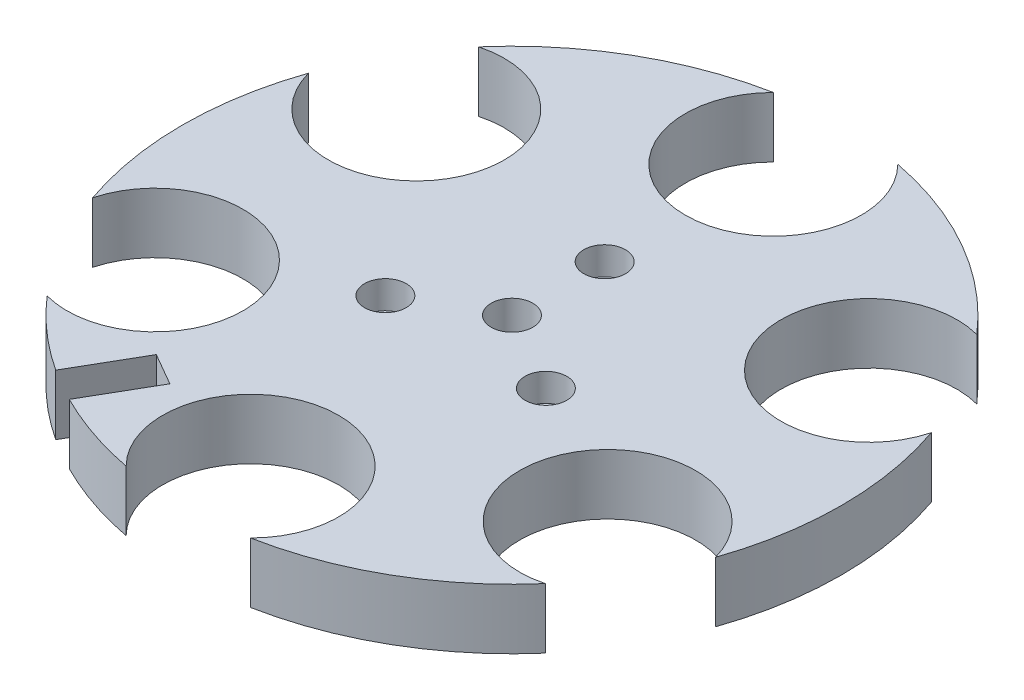
ISO-10303-21;
HEADER;
FILE_DESCRIPTION(('STEP AP214'),'2;1');
FILE_NAME('part.step','',(''),(''),'','','');
FILE_SCHEMA(('AUTOMOTIVE_DESIGN { 1 0 10303 214 1 1 1 1 }'));
ENDSEC;
DATA;
#1=APPLICATION_CONTEXT('core data for automotive mechanical design processes');
#2=APPLICATION_PROTOCOL_DEFINITION('international standard','automotive_design',2000,#1);
#3=PRODUCT_CONTEXT('',#1,'mechanical');
#4=PRODUCT('Part','Part','',(#3));
#5=PRODUCT_RELATED_PRODUCT_CATEGORY('part','',(#4));
#6=PRODUCT_DEFINITION_FORMATION('','',#4);
#7=PRODUCT_DEFINITION_CONTEXT('part definition',#1,'design');
#8=PRODUCT_DEFINITION('design','',#6,#7);
#9=PRODUCT_DEFINITION_SHAPE('','',#8);
#10=(LENGTH_UNIT() NAMED_UNIT(*) SI_UNIT(.MILLI.,.METRE.));
#11=(NAMED_UNIT(*) PLANE_ANGLE_UNIT() SI_UNIT($,.RADIAN.));
#12=(NAMED_UNIT(*) SI_UNIT($,.STERADIAN.) SOLID_ANGLE_UNIT());
#13=UNCERTAINTY_MEASURE_WITH_UNIT(LENGTH_MEASURE(1.E-05),#10,'distance_accuracy_value','');
#14=(GEOMETRIC_REPRESENTATION_CONTEXT(3) GLOBAL_UNCERTAINTY_ASSIGNED_CONTEXT((#13)) GLOBAL_UNIT_ASSIGNED_CONTEXT((#10,
#11,#12)) REPRESENTATION_CONTEXT('',''));
#15=CARTESIAN_POINT('',(0.,0.,0.));
#16=DIRECTION('',(0.,0.,1.));
#17=DIRECTION('',(1.,0.,0.));
#18=AXIS2_PLACEMENT_3D('',#15,#16,#17);
#19=CARTESIAN_POINT('',(0.,3.25,0.));
#20=DIRECTION('',(0.,-1.,0.));
#21=DIRECTION('',(0.,0.,-1.));
#22=AXIS2_PLACEMENT_3D('',#19,#20,#21);
#23=CYLINDRICAL_SURFACE('',#22,35.56);
#24=CARTESIAN_POINT('',(0.,-3.25,0.));
#25=DIRECTION('',(0.,1.,0.));
#26=DIRECTION('',(0.,0.,1.));
#27=AXIS2_PLACEMENT_3D('',#24,#25,#26);
#28=CIRCLE('',#27,35.56);
#29=CARTESIAN_POINT('',(-26.8844710838169,-3.25,23.275283339702));
#30=VERTEX_POINT('',#29);
#31=CARTESIAN_POINT('',(-19.4839070485369,-3.25,29.7471169380156));
#32=VERTEX_POINT('',#31);
#33=EDGE_CURVE('E316',#30,#32,#28,.T.);
#34=ORIENTED_EDGE('',*,*,#33,.T.);
#35=DIRECTION('',(0.,-1.,0.));
#36=VECTOR('',#35,1.);
#37=CARTESIAN_POINT('',(-19.4839070485368,3.25,29.7471169380156));
#38=LINE('',#37,#36);
#39=CARTESIAN_POINT('',(-19.4839070485369,3.25,29.7471169380156));
#40=VERTEX_POINT('',#39);
#41=EDGE_CURVE('E50',#32,#40,#38,.F.);
#42=ORIENTED_EDGE('',*,*,#41,.T.);
#43=CARTESIAN_POINT('',(0.,3.25,0.));
#44=DIRECTION('',(0.,1.,0.));
#45=DIRECTION('',(0.,0.,1.));
#46=AXIS2_PLACEMENT_3D('',#43,#44,#45);
#47=CIRCLE('',#46,35.56);
#48=CARTESIAN_POINT('',(-26.8844710838169,3.25,23.275283339702));
#49=VERTEX_POINT('',#48);
#50=EDGE_CURVE('E167',#49,#40,#47,.T.);
#51=ORIENTED_EDGE('',*,*,#50,.F.);
#52=DIRECTION('',(0.,1.,0.));
#53=VECTOR('',#52,1.);
#54=CARTESIAN_POINT('',(-26.8844710838169,0.,23.275283339702));
#55=LINE('',#54,#53);
#56=EDGE_CURVE('E231',#49,#30,#55,.F.);
#57=ORIENTED_EDGE('',*,*,#56,.T.);
#58=EDGE_LOOP('',(#34,#42,#51,#57));
#59=FACE_BOUND('',#58,.T.);
#60=ADVANCED_FACE('F35',(#59),#23,.T.);
#61=CARTESIAN_POINT('',(33.5992221943712,-3.25,11.6449932560425));
#62=VERTEX_POINT('',#61);
#63=CARTESIAN_POINT('',(33.5992221943709,-3.25,-11.6449932560432));
#64=VERTEX_POINT('',#63);
#65=EDGE_CURVE('E320',#62,#64,#28,.T.);
#66=ORIENTED_EDGE('',*,*,#65,.T.);
#67=DIRECTION('',(0.,1.,0.));
#68=VECTOR('',#67,1.);
#69=CARTESIAN_POINT('',(33.5992221943709,0.,-11.6449932560432));
#70=LINE('',#69,#68);
#71=CARTESIAN_POINT('',(33.5992221943709,3.25,-11.6449932560432));
#72=VERTEX_POINT('',#71);
#73=EDGE_CURVE('E57',#64,#72,#70,.T.);
#74=ORIENTED_EDGE('',*,*,#73,.T.);
#75=CARTESIAN_POINT('',(33.5992221943712,3.25,11.6449932560425));
#76=VERTEX_POINT('',#75);
#77=EDGE_CURVE('E334',#76,#72,#47,.T.);
#78=ORIENTED_EDGE('',*,*,#77,.F.);
#79=DIRECTION('',(0.,1.,0.));
#80=VECTOR('',#79,1.);
#81=CARTESIAN_POINT('',(33.5992221943712,0.,11.6449932560425));
#82=LINE('',#81,#80);
#83=EDGE_CURVE('E243',#76,#62,#82,.F.);
#84=ORIENTED_EDGE('',*,*,#83,.T.);
#85=EDGE_LOOP('',(#66,#74,#78,#84));
#86=FACE_BOUND('',#85,.T.);
#87=ADVANCED_FACE('F327',(#86),#23,.T.);
#88=CARTESIAN_POINT('',(6.714751110554,-3.25,34.9202765957447));
#89=VERTEX_POINT('',#88);
#90=CARTESIAN_POINT('',(26.8844710838173,-3.25,23.2752833397016));
#91=VERTEX_POINT('',#90);
#92=EDGE_CURVE('E317',#89,#91,#28,.T.);
#93=ORIENTED_EDGE('',*,*,#92,.T.);
#94=DIRECTION('',(0.,1.,0.));
#95=VECTOR('',#94,1.);
#96=CARTESIAN_POINT('',(26.8844710838173,0.,23.2752833397016));
#97=LINE('',#96,#95);
#98=CARTESIAN_POINT('',(26.8844710838173,3.25,23.2752833397016));
#99=VERTEX_POINT('',#98);
#100=EDGE_CURVE('E246',#91,#99,#97,.T.);
#101=ORIENTED_EDGE('',*,*,#100,.T.);
#102=CARTESIAN_POINT('',(6.714751110554,3.25,34.9202765957447));
#103=VERTEX_POINT('',#102);
#104=EDGE_CURVE('E335',#103,#99,#47,.T.);
#105=ORIENTED_EDGE('',*,*,#104,.F.);
#106=DIRECTION('',(0.,1.,0.));
#107=VECTOR('',#106,1.);
#108=CARTESIAN_POINT('',(6.714751110554,0.,34.9202765957447));
#109=LINE('',#108,#107);
#110=EDGE_CURVE('E237',#103,#89,#109,.F.);
#111=ORIENTED_EDGE('',*,*,#110,.T.);
#112=EDGE_LOOP('',(#93,#101,#105,#111));
#113=FACE_BOUND('',#112,.T.);
#114=ADVANCED_FACE('F342',(#113),#23,.T.);
#115=CARTESIAN_POINT('',(-16.0198054333988,3.25,31.7471169380158));
#116=VERTEX_POINT('',#115);
#117=CARTESIAN_POINT('',(-6.714751110554,3.25,34.9202765957447));
#118=VERTEX_POINT('',#117);
#119=EDGE_CURVE('E268',#116,#118,#47,.T.);
#120=ORIENTED_EDGE('',*,*,#119,.F.);
#121=DIRECTION('',(0.,-1.,0.));
#122=VECTOR('',#121,1.);
#123=CARTESIAN_POINT('',(-16.0198054333988,3.25,31.7471169380157));
#124=LINE('',#123,#122);
#125=CARTESIAN_POINT('',(-16.0198054333988,-3.25,31.7471169380158));
#126=VERTEX_POINT('',#125);
#127=EDGE_CURVE('E178',#116,#126,#124,.T.);
#128=ORIENTED_EDGE('',*,*,#127,.T.);
#129=CARTESIAN_POINT('',(-6.714751110554,-3.25,34.9202765957447));
#130=VERTEX_POINT('',#129);
#131=EDGE_CURVE('E274',#126,#130,#28,.T.);
#132=ORIENTED_EDGE('',*,*,#131,.T.);
#133=DIRECTION('',(0.,1.,0.));
#134=VECTOR('',#133,1.);
#135=CARTESIAN_POINT('',(-6.714751110554,0.,34.9202765957447));
#136=LINE('',#135,#134);
#137=EDGE_CURVE('E240',#130,#118,#136,.T.);
#138=ORIENTED_EDGE('',*,*,#137,.T.);
#139=EDGE_LOOP('',(#120,#128,#132,#138));
#140=FACE_BOUND('',#139,.T.);
#141=ADVANCED_FACE('F374',(#140),#23,.T.);
#142=CARTESIAN_POINT('',(-33.5992221943711,-3.25,-11.6449932560427));
#143=VERTEX_POINT('',#142);
#144=CARTESIAN_POINT('',(-33.599222194371,-3.25,11.6449932560429));
#145=VERTEX_POINT('',#144);
#146=EDGE_CURVE('E273',#143,#145,#28,.T.);
#147=ORIENTED_EDGE('',*,*,#146,.T.);
#148=DIRECTION('',(0.,1.,0.));
#149=VECTOR('',#148,1.);
#150=CARTESIAN_POINT('',(-33.599222194371,0.,11.6449932560429));
#151=LINE('',#150,#149);
#152=CARTESIAN_POINT('',(-33.599222194371,3.25,11.6449932560429));
#153=VERTEX_POINT('',#152);
#154=EDGE_CURVE('E234',#145,#153,#151,.T.);
#155=ORIENTED_EDGE('',*,*,#154,.T.);
#156=CARTESIAN_POINT('',(-33.5992221943711,3.25,-11.6449932560427));
#157=VERTEX_POINT('',#156);
#158=EDGE_CURVE('E267',#157,#153,#47,.T.);
#159=ORIENTED_EDGE('',*,*,#158,.F.);
#160=DIRECTION('',(0.,1.,0.));
#161=VECTOR('',#160,1.);
#162=CARTESIAN_POINT('',(-33.5992221943711,0.,-11.6449932560427));
#163=LINE('',#162,#161);
#164=EDGE_CURVE('E225',#157,#143,#163,.F.);
#165=ORIENTED_EDGE('',*,*,#164,.T.);
#166=EDGE_LOOP('',(#147,#155,#159,#165));
#167=FACE_BOUND('',#166,.T.);
#168=ADVANCED_FACE('F369',(#167),#23,.T.);
#169=CARTESIAN_POINT('',(-6.714751110554,-3.25,-34.9202765957447));
#170=VERTEX_POINT('',#169);
#171=CARTESIAN_POINT('',(-26.8844710838171,-3.25,-23.2752833397018));
#172=VERTEX_POINT('',#171);
#173=EDGE_CURVE('E269',#170,#172,#28,.T.);
#174=ORIENTED_EDGE('',*,*,#173,.T.);
#175=DIRECTION('',(0.,1.,0.));
#176=VECTOR('',#175,1.);
#177=CARTESIAN_POINT('',(-26.8844710838171,0.,-23.2752833397018));
#178=LINE('',#177,#176);
#179=CARTESIAN_POINT('',(-26.8844710838171,3.25,-23.2752833397018));
#180=VERTEX_POINT('',#179);
#181=EDGE_CURVE('E228',#172,#180,#178,.T.);
#182=ORIENTED_EDGE('',*,*,#181,.T.);
#183=CARTESIAN_POINT('',(-6.714751110554,3.25,-34.9202765957447));
#184=VERTEX_POINT('',#183);
#185=EDGE_CURVE('E263',#184,#180,#47,.T.);
#186=ORIENTED_EDGE('',*,*,#185,.F.);
#187=DIRECTION('',(0.,1.,0.));
#188=VECTOR('',#187,1.);
#189=CARTESIAN_POINT('',(-6.714751110554,0.,-34.9202765957447));
#190=LINE('',#189,#188);
#191=EDGE_CURVE('E256',#184,#170,#190,.F.);
#192=ORIENTED_EDGE('',*,*,#191,.T.);
#193=EDGE_LOOP('',(#174,#182,#186,#192));
#194=FACE_BOUND('',#193,.T.);
#195=ADVANCED_FACE('F363',(#194),#23,.T.);
#196=CARTESIAN_POINT('',(26.8844710838168,3.25,-23.2752833397022));
#197=VERTEX_POINT('',#196);
#198=CARTESIAN_POINT('',(6.714751110554,3.25,-34.9202765957447));
#199=VERTEX_POINT('',#198);
#200=EDGE_CURVE('E272',#197,#199,#47,.T.);
#201=ORIENTED_EDGE('',*,*,#200,.F.);
#202=DIRECTION('',(0.,1.,0.));
#203=VECTOR('',#202,1.);
#204=CARTESIAN_POINT('',(26.8844710838168,0.,-23.2752833397022));
#205=LINE('',#204,#203);
#206=CARTESIAN_POINT('',(26.8844710838168,-3.25,-23.2752833397022));
#207=VERTEX_POINT('',#206);
#208=EDGE_CURVE('E249',#197,#207,#205,.F.);
#209=ORIENTED_EDGE('',*,*,#208,.T.);
#210=CARTESIAN_POINT('',(6.714751110554,-3.25,-34.9202765957447));
#211=VERTEX_POINT('',#210);
#212=EDGE_CURVE('E262',#207,#211,#28,.T.);
#213=ORIENTED_EDGE('',*,*,#212,.T.);
#214=DIRECTION('',(0.,1.,0.));
#215=VECTOR('',#214,1.);
#216=CARTESIAN_POINT('',(6.714751110554,0.,-34.9202765957447));
#217=LINE('',#216,#215);
#218=EDGE_CURVE('E259',#211,#199,#217,.T.);
#219=ORIENTED_EDGE('',*,*,#218,.T.);
#220=EDGE_LOOP('',(#201,#209,#213,#219));
#221=FACE_BOUND('',#220,.T.);
#222=ADVANCED_FACE('F37',(#221),#23,.T.);
#223=CARTESIAN_POINT('',(0.,3.25,0.));
#224=DIRECTION('',(0.,1.,0.));
#225=DIRECTION('',(0.,0.,1.));
#226=AXIS2_PLACEMENT_3D('',#223,#224,#225);
#227=PLANE('',#226);
#228=DIRECTION('',(-0.499999999999958,0.,0.866025403784463));
#229=VECTOR('',#228,1.);
#230=CARTESIAN_POINT('',(-12.0479491924309,3.25,24.8676601282992));
#231=LINE('',#230,#229);
#232=CARTESIAN_POINT('',(-12.0479491924309,3.25,24.8676601282992));
#233=VERTEX_POINT('',#232);
#234=EDGE_CURVE('E168',#233,#116,#231,.T.);
#235=ORIENTED_EDGE('',*,*,#234,.T.);
#236=ORIENTED_EDGE('',*,*,#119,.T.);
#237=CARTESIAN_POINT('',(0.,3.25,28.2));
#238=DIRECTION('',(0.,1.,0.));
#239=DIRECTION('',(0.,0.,-1.));
#240=AXIS2_PLACEMENT_3D('',#237,#238,#239);
#241=CIRCLE('',#240,9.5);
#242=EDGE_CURVE('E218',#103,#118,#241,.T.);
#243=ORIENTED_EDGE('',*,*,#242,.F.);
#244=ORIENTED_EDGE('',*,*,#104,.T.);
#245=CARTESIAN_POINT('',(24.4219163867213,3.25,14.0999999999998));
#246=DIRECTION('',(0.,1.,0.));
#247=DIRECTION('',(-0.866025403784443,0.,-0.499999999999992));
#248=AXIS2_PLACEMENT_3D('',#245,#246,#247);
#249=CIRCLE('',#248,9.5);
#250=EDGE_CURVE('E221',#76,#99,#249,.T.);
#251=ORIENTED_EDGE('',*,*,#250,.F.);
#252=ORIENTED_EDGE('',*,*,#77,.T.);
#253=CARTESIAN_POINT('',(24.421916386721,3.25,-14.1000000000003));
#254=DIRECTION('',(0.,1.,0.));
#255=DIRECTION('',(-0.866025403784433,0.,0.50000000000001));
#256=AXIS2_PLACEMENT_3D('',#253,#254,#255);
#257=CIRCLE('',#256,9.5);
#258=EDGE_CURVE('E212',#197,#72,#257,.T.);
#259=ORIENTED_EDGE('',*,*,#258,.F.);
#260=ORIENTED_EDGE('',*,*,#200,.T.);
#261=CARTESIAN_POINT('',(0.,3.25,-28.2));
#262=DIRECTION('',(0.,1.,0.));
#263=DIRECTION('',(0.,0.,1.));
#264=AXIS2_PLACEMENT_3D('',#261,#262,#263);
#265=CIRCLE('',#264,9.5);
#266=EDGE_CURVE('E253',#184,#199,#265,.T.);
#267=ORIENTED_EDGE('',*,*,#266,.F.);
#268=ORIENTED_EDGE('',*,*,#185,.T.);
#269=CARTESIAN_POINT('',(-24.4219163867212,3.25,-14.0999999999999));
#270=DIRECTION('',(0.,1.,0.));
#271=DIRECTION('',(0.86602540378444,0.,0.499999999999998));
#272=AXIS2_PLACEMENT_3D('',#269,#270,#271);
#273=CIRCLE('',#272,9.5);
#274=EDGE_CURVE('E217',#157,#180,#273,.T.);
#275=ORIENTED_EDGE('',*,*,#274,.F.);
#276=ORIENTED_EDGE('',*,*,#158,.T.);
#277=CARTESIAN_POINT('',(-24.4219163867211,3.25,14.1000000000001));
#278=DIRECTION('',(0.,1.,0.));
#279=DIRECTION('',(0.866025403784436,0.,-0.500000000000004));
#280=AXIS2_PLACEMENT_3D('',#277,#278,#279);
#281=CIRCLE('',#280,9.5);
#282=EDGE_CURVE('E215',#49,#153,#281,.T.);
#283=ORIENTED_EDGE('',*,*,#282,.F.);
#284=ORIENTED_EDGE('',*,*,#50,.T.);
#285=DIRECTION('',(0.499999999999995,0.,-0.866025403784442));
#286=VECTOR('',#285,1.);
#287=CARTESIAN_POINT('',(-15.5120508075687,3.25,22.8676601282992));
#288=LINE('',#287,#286);
#289=CARTESIAN_POINT('',(-15.5120508075687,3.25,22.8676601282992));
#290=VERTEX_POINT('',#289);
#291=EDGE_CURVE('E149',#40,#290,#288,.T.);
#292=ORIENTED_EDGE('',*,*,#291,.T.);
#293=DIRECTION('',(0.866025403784447,0.,0.499999999999985));
#294=VECTOR('',#293,1.);
#295=CARTESIAN_POINT('',(-12.0479491924309,3.25,24.8676601282992));
#296=LINE('',#295,#294);
#297=EDGE_CURVE('E154',#290,#233,#296,.T.);
#298=ORIENTED_EDGE('',*,*,#297,.T.);
#299=EDGE_LOOP('',(#235,#236,#243,#244,#251,#252,#259,#260,#267,#268,#275,#276,#283,#284,#292,#298));
#300=FACE_BOUND('',#299,.T.);
#301=CARTESIAN_POINT('',(0.,3.25,0.));
#302=DIRECTION('',(0.,1.,0.));
#303=DIRECTION('',(0.,0.,1.));
#304=AXIS2_PLACEMENT_3D('',#301,#302,#303);
#305=CIRCLE('',#304,2.25);
#306=CARTESIAN_POINT('',(0.,3.25,2.25));
#307=VERTEX_POINT('',#306);
#308=EDGE_CURVE('E193',#307,#307,#305,.T.);
#309=ORIENTED_EDGE('',*,*,#308,.F.);
#310=EDGE_LOOP('',(#309));
#311=FACE_BOUND('',#310,.T.);
#312=CARTESIAN_POINT('',(-8.66025403784437,3.25,5.00000000000004));
#313=DIRECTION('',(0.,1.,0.));
#314=DIRECTION('',(0.866025403784436,0.,-0.500000000000004));
#315=AXIS2_PLACEMENT_3D('',#312,#313,#314);
#316=CIRCLE('',#315,2.25);
#317=CARTESIAN_POINT('',(-6.71169687932938,3.25,3.87500000000003));
#318=VERTEX_POINT('',#317);
#319=EDGE_CURVE('E201',#318,#318,#316,.T.);
#320=ORIENTED_EDGE('',*,*,#319,.F.);
#321=EDGE_LOOP('',(#320));
#322=FACE_BOUND('',#321,.T.);
#323=CARTESIAN_POINT('',(8.66025403784443,3.25,4.99999999999992));
#324=DIRECTION('',(0.,1.,0.));
#325=DIRECTION('',(-0.866025403784443,0.,-0.499999999999992));
#326=AXIS2_PLACEMENT_3D('',#323,#324,#325);
#327=CIRCLE('',#326,2.25);
#328=CARTESIAN_POINT('',(6.71169687932943,3.25,3.87499999999994));
#329=VERTEX_POINT('',#328);
#330=EDGE_CURVE('E196',#329,#329,#327,.T.);
#331=ORIENTED_EDGE('',*,*,#330,.F.);
#332=EDGE_LOOP('',(#331));
#333=FACE_BOUND('',#332,.T.);
#334=CARTESIAN_POINT('',(0.,3.25,-10.));
#335=DIRECTION('',(0.,1.,0.));
#336=DIRECTION('',(0.,0.,1.));
#337=AXIS2_PLACEMENT_3D('',#334,#335,#336);
#338=CIRCLE('',#337,2.25);
#339=CARTESIAN_POINT('',(0.,3.25,-7.75));
#340=VERTEX_POINT('',#339);
#341=EDGE_CURVE('E200',#340,#340,#338,.T.);
#342=ORIENTED_EDGE('',*,*,#341,.F.);
#343=EDGE_LOOP('',(#342));
#344=FACE_BOUND('',#343,.T.);
#345=ADVANCED_FACE('F163',(#300,#311,#322,#333,#344),#227,.T.);
#346=CARTESIAN_POINT('',(0.,-3.25,0.));
#347=DIRECTION('',(0.,1.,0.));
#348=DIRECTION('',(0.,0.,1.));
#349=AXIS2_PLACEMENT_3D('',#346,#347,#348);
#350=PLANE('',#349);
#351=CARTESIAN_POINT('',(8.66025403784443,-3.25,4.99999999999992));
#352=DIRECTION('',(0.,1.,0.));
#353=DIRECTION('',(0.,0.,1.));
#354=AXIS2_PLACEMENT_3D('',#351,#352,#353);
#355=CIRCLE('',#354,2.);
#356=CARTESIAN_POINT('',(8.66025403784443,-3.25,6.99999999999992));
#357=VERTEX_POINT('',#356);
#358=EDGE_CURVE('E43',#357,#357,#355,.F.);
#359=ORIENTED_EDGE('',*,*,#358,.F.);
#360=EDGE_LOOP('',(#359));
#361=FACE_BOUND('',#360,.T.);
#362=CARTESIAN_POINT('',(-8.66025403784437,-3.25,5.00000000000004));
#363=DIRECTION('',(0.,1.,0.));
#364=DIRECTION('',(0.,0.,1.));
#365=AXIS2_PLACEMENT_3D('',#362,#363,#364);
#366=CIRCLE('',#365,2.);
#367=CARTESIAN_POINT('',(-8.66025403784437,-3.25,7.00000000000004));
#368=VERTEX_POINT('',#367);
#369=EDGE_CURVE('E294',#368,#368,#366,.F.);
#370=ORIENTED_EDGE('',*,*,#369,.F.);
#371=EDGE_LOOP('',(#370));
#372=FACE_BOUND('',#371,.T.);
#373=CARTESIAN_POINT('',(0.,-3.25,-10.));
#374=DIRECTION('',(0.,1.,0.));
#375=DIRECTION('',(0.,0.,1.));
#376=AXIS2_PLACEMENT_3D('',#373,#374,#375);
#377=CIRCLE('',#376,2.);
#378=CARTESIAN_POINT('',(0.,-3.25,-8.));
#379=VERTEX_POINT('',#378);
#380=EDGE_CURVE('E291',#379,#379,#377,.F.);
#381=ORIENTED_EDGE('',*,*,#380,.F.);
#382=EDGE_LOOP('',(#381));
#383=FACE_BOUND('',#382,.T.);
#384=CARTESIAN_POINT('',(0.,-3.25,0.));
#385=DIRECTION('',(0.,1.,0.));
#386=DIRECTION('',(0.,0.,1.));
#387=AXIS2_PLACEMENT_3D('',#384,#385,#386);
#388=CIRCLE('',#387,2.25);
#389=CARTESIAN_POINT('',(0.,-3.25,2.25));
#390=VERTEX_POINT('',#389);
#391=EDGE_CURVE('E190',#390,#390,#388,.T.);
#392=ORIENTED_EDGE('',*,*,#391,.T.);
#393=EDGE_LOOP('',(#392));
#394=FACE_BOUND('',#393,.T.);
#395=ORIENTED_EDGE('',*,*,#131,.F.);
#396=DIRECTION('',(-0.499999999999958,0.,0.866025403784463));
#397=VECTOR('',#396,1.);
#398=CARTESIAN_POINT('',(-12.0479491924309,-3.25,24.8676601282992));
#399=LINE('',#398,#397);
#400=CARTESIAN_POINT('',(-12.0479491924309,-3.25,24.8676601282992));
#401=VERTEX_POINT('',#400);
#402=EDGE_CURVE('E173',#401,#126,#399,.T.);
#403=ORIENTED_EDGE('',*,*,#402,.F.);
#404=DIRECTION('',(0.866025403784447,0.,0.499999999999985));
#405=VECTOR('',#404,1.);
#406=CARTESIAN_POINT('',(-12.0479491924309,-3.25,24.8676601282992));
#407=LINE('',#406,#405);
#408=CARTESIAN_POINT('',(-15.5120508075687,-3.25,22.8676601282992));
#409=VERTEX_POINT('',#408);
#410=EDGE_CURVE('E170',#409,#401,#407,.T.);
#411=ORIENTED_EDGE('',*,*,#410,.F.);
#412=DIRECTION('',(-0.499999999999995,0.,0.866025403784442));
#413=VECTOR('',#412,1.);
#414=CARTESIAN_POINT('',(-1.73205080756889,-3.25,-0.999999999999992));
#415=LINE('',#414,#413);
#416=EDGE_CURVE('E11',#409,#32,#415,.T.);
#417=ORIENTED_EDGE('',*,*,#416,.T.);
#418=ORIENTED_EDGE('',*,*,#33,.F.);
#419=CARTESIAN_POINT('',(-24.4219163867211,-3.25,14.1000000000001));
#420=DIRECTION('',(0.,1.,0.));
#421=DIRECTION('',(0.,0.,1.));
#422=AXIS2_PLACEMENT_3D('',#419,#420,#421);
#423=CIRCLE('',#422,9.5);
#424=EDGE_CURVE('E280',#30,#145,#423,.T.);
#425=ORIENTED_EDGE('',*,*,#424,.T.);
#426=ORIENTED_EDGE('',*,*,#146,.F.);
#427=CARTESIAN_POINT('',(-24.4219163867212,-3.25,-14.0999999999999));
#428=DIRECTION('',(0.,1.,0.));
#429=DIRECTION('',(0.,0.,1.));
#430=AXIS2_PLACEMENT_3D('',#427,#428,#429);
#431=CIRCLE('',#430,9.5);
#432=EDGE_CURVE('E277',#143,#172,#431,.T.);
#433=ORIENTED_EDGE('',*,*,#432,.T.);
#434=ORIENTED_EDGE('',*,*,#173,.F.);
#435=CARTESIAN_POINT('',(0.,-3.25,-28.2));
#436=DIRECTION('',(0.,1.,0.));
#437=DIRECTION('',(0.,0.,1.));
#438=AXIS2_PLACEMENT_3D('',#435,#436,#437);
#439=CIRCLE('',#438,9.5);
#440=EDGE_CURVE('E266',#170,#211,#439,.T.);
#441=ORIENTED_EDGE('',*,*,#440,.T.);
#442=ORIENTED_EDGE('',*,*,#212,.F.);
#443=CARTESIAN_POINT('',(24.421916386721,-3.25,-14.1000000000003));
#444=DIRECTION('',(0.,1.,0.));
#445=DIRECTION('',(0.,0.,1.));
#446=AXIS2_PLACEMENT_3D('',#443,#444,#445);
#447=CIRCLE('',#446,9.5);
#448=EDGE_CURVE('E289',#207,#64,#447,.T.);
#449=ORIENTED_EDGE('',*,*,#448,.T.);
#450=ORIENTED_EDGE('',*,*,#65,.F.);
#451=CARTESIAN_POINT('',(24.4219163867213,-3.25,14.0999999999998));
#452=DIRECTION('',(0.,1.,0.));
#453=DIRECTION('',(0.,0.,1.));
#454=AXIS2_PLACEMENT_3D('',#451,#452,#453);
#455=CIRCLE('',#454,9.5);
#456=EDGE_CURVE('E286',#62,#91,#455,.T.);
#457=ORIENTED_EDGE('',*,*,#456,.T.);
#458=ORIENTED_EDGE('',*,*,#92,.F.);
#459=CARTESIAN_POINT('',(0.,-3.25,28.2));
#460=DIRECTION('',(0.,1.,0.));
#461=DIRECTION('',(0.,0.,1.));
#462=AXIS2_PLACEMENT_3D('',#459,#460,#461);
#463=CIRCLE('',#462,9.5);
#464=EDGE_CURVE('E283',#89,#130,#463,.T.);
#465=ORIENTED_EDGE('',*,*,#464,.T.);
#466=EDGE_LOOP('',(#395,#403,#411,#417,#418,#425,#426,#433,#434,#441,#442,#449,#450,#457,#458,#465));
#467=FACE_BOUND('',#466,.T.);
#468=ADVANCED_FACE('F301',(#361,#372,#383,#394,#467),#350,.F.);
#469=CARTESIAN_POINT('',(0.,-3.25,-28.2));
#470=DIRECTION('',(0.,1.,0.));
#471=DIRECTION('',(0.,0.,1.));
#472=AXIS2_PLACEMENT_3D('',#469,#470,#471);
#473=CYLINDRICAL_SURFACE('',#472,9.5);
#474=ORIENTED_EDGE('',*,*,#440,.F.);
#475=ORIENTED_EDGE('',*,*,#191,.F.);
#476=ORIENTED_EDGE('',*,*,#266,.T.);
#477=ORIENTED_EDGE('',*,*,#218,.F.);
#478=EDGE_LOOP('',(#474,#475,#476,#477));
#479=FACE_BOUND('',#478,.T.);
#480=ADVANCED_FACE('F304',(#479),#473,.F.);
#481=CARTESIAN_POINT('',(-24.4219163867212,-3.25,-14.0999999999999));
#482=DIRECTION('',(0.,1.,0.));
#483=DIRECTION('',(0.,0.,1.));
#484=AXIS2_PLACEMENT_3D('',#481,#482,#483);
#485=CYLINDRICAL_SURFACE('',#484,9.5);
#486=ORIENTED_EDGE('',*,*,#432,.F.);
#487=ORIENTED_EDGE('',*,*,#164,.F.);
#488=ORIENTED_EDGE('',*,*,#274,.T.);
#489=ORIENTED_EDGE('',*,*,#181,.F.);
#490=EDGE_LOOP('',(#486,#487,#488,#489));
#491=FACE_BOUND('',#490,.T.);
#492=ADVANCED_FACE('F381',(#491),#485,.F.);
#493=CARTESIAN_POINT('',(-24.4219163867211,-3.25,14.1000000000001));
#494=DIRECTION('',(0.,1.,0.));
#495=DIRECTION('',(0.,0.,1.));
#496=AXIS2_PLACEMENT_3D('',#493,#494,#495);
#497=CYLINDRICAL_SURFACE('',#496,9.5);
#498=ORIENTED_EDGE('',*,*,#424,.F.);
#499=ORIENTED_EDGE('',*,*,#56,.F.);
#500=ORIENTED_EDGE('',*,*,#282,.T.);
#501=ORIENTED_EDGE('',*,*,#154,.F.);
#502=EDGE_LOOP('',(#498,#499,#500,#501));
#503=FACE_BOUND('',#502,.T.);
#504=ADVANCED_FACE('F354',(#503),#497,.F.);
#505=CARTESIAN_POINT('',(0.,-3.25,28.2));
#506=DIRECTION('',(0.,1.,0.));
#507=DIRECTION('',(0.,0.,1.));
#508=AXIS2_PLACEMENT_3D('',#505,#506,#507);
#509=CYLINDRICAL_SURFACE('',#508,9.5);
#510=ORIENTED_EDGE('',*,*,#464,.F.);
#511=ORIENTED_EDGE('',*,*,#110,.F.);
#512=ORIENTED_EDGE('',*,*,#242,.T.);
#513=ORIENTED_EDGE('',*,*,#137,.F.);
#514=EDGE_LOOP('',(#510,#511,#512,#513));
#515=FACE_BOUND('',#514,.T.);
#516=ADVANCED_FACE('F346',(#515),#509,.F.);
#517=CARTESIAN_POINT('',(24.4219163867213,-3.25,14.0999999999998));
#518=DIRECTION('',(0.,1.,0.));
#519=DIRECTION('',(0.,0.,1.));
#520=AXIS2_PLACEMENT_3D('',#517,#518,#519);
#521=CYLINDRICAL_SURFACE('',#520,9.5);
#522=ORIENTED_EDGE('',*,*,#456,.F.);
#523=ORIENTED_EDGE('',*,*,#83,.F.);
#524=ORIENTED_EDGE('',*,*,#250,.T.);
#525=ORIENTED_EDGE('',*,*,#100,.F.);
#526=EDGE_LOOP('',(#522,#523,#524,#525));
#527=FACE_BOUND('',#526,.T.);
#528=ADVANCED_FACE('F344',(#527),#521,.F.);
#529=CARTESIAN_POINT('',(24.421916386721,-3.25,-14.1000000000003));
#530=DIRECTION('',(0.,1.,0.));
#531=DIRECTION('',(0.,0.,1.));
#532=AXIS2_PLACEMENT_3D('',#529,#530,#531);
#533=CYLINDRICAL_SURFACE('',#532,9.5);
#534=ORIENTED_EDGE('',*,*,#448,.F.);
#535=ORIENTED_EDGE('',*,*,#208,.F.);
#536=ORIENTED_EDGE('',*,*,#258,.T.);
#537=ORIENTED_EDGE('',*,*,#73,.F.);
#538=EDGE_LOOP('',(#534,#535,#536,#537));
#539=FACE_BOUND('',#538,.T.);
#540=ADVANCED_FACE('F330',(#539),#533,.F.);
#541=CARTESIAN_POINT('',(0.,0.25,-10.));
#542=DIRECTION('',(0.,1.,0.));
#543=DIRECTION('',(0.,0.,1.));
#544=AXIS2_PLACEMENT_3D('',#541,#542,#543);
#545=CYLINDRICAL_SURFACE('',#544,2.25);
#546=CARTESIAN_POINT('',(0.,0.25,-10.));
#547=DIRECTION('',(0.,1.,0.));
#548=DIRECTION('',(0.,0.,1.));
#549=AXIS2_PLACEMENT_3D('',#546,#547,#548);
#550=CIRCLE('',#549,2.25);
#551=CARTESIAN_POINT('',(0.,0.25,-7.75));
#552=VERTEX_POINT('',#551);
#553=EDGE_CURVE('E209',#552,#552,#550,.T.);
#554=ORIENTED_EDGE('',*,*,#553,.F.);
#555=EDGE_LOOP('',(#554));
#556=FACE_BOUND('',#555,.T.);
#557=ORIENTED_EDGE('',*,*,#341,.T.);
#558=EDGE_LOOP('',(#557));
#559=FACE_BOUND('',#558,.T.);
#560=ADVANCED_FACE('F352',(#556,#559),#545,.F.);
#561=CARTESIAN_POINT('',(0.,0.25,-10.));
#562=DIRECTION('',(0.,1.,0.));
#563=DIRECTION('',(0.,0.,1.));
#564=AXIS2_PLACEMENT_3D('',#561,#562,#563);
#565=PLANE('',#564);
#566=ORIENTED_EDGE('',*,*,#553,.T.);
#567=EDGE_LOOP('',(#566));
#568=FACE_BOUND('',#567,.T.);
#569=ADVANCED_FACE('F402',(#568),#565,.T.);
#570=CARTESIAN_POINT('',(8.66025403784443,0.25,4.99999999999992));
#571=DIRECTION('',(0.,1.,0.));
#572=DIRECTION('',(0.,0.,1.));
#573=AXIS2_PLACEMENT_3D('',#570,#571,#572);
#574=CYLINDRICAL_SURFACE('',#573,2.25);
#575=CARTESIAN_POINT('',(8.66025403784443,0.25,4.99999999999992));
#576=DIRECTION('',(0.,1.,0.));
#577=DIRECTION('',(-0.866025403784443,0.,-0.499999999999992));
#578=AXIS2_PLACEMENT_3D('',#575,#576,#577);
#579=CIRCLE('',#578,2.25);
#580=CARTESIAN_POINT('',(6.71169687932943,0.25,3.87499999999994));
#581=VERTEX_POINT('',#580);
#582=EDGE_CURVE('E204',#581,#581,#579,.T.);
#583=ORIENTED_EDGE('',*,*,#582,.F.);
#584=EDGE_LOOP('',(#583));
#585=FACE_BOUND('',#584,.T.);
#586=ORIENTED_EDGE('',*,*,#330,.T.);
#587=EDGE_LOOP('',(#586));
#588=FACE_BOUND('',#587,.T.);
#589=ADVANCED_FACE('F406',(#585,#588),#574,.F.);
#590=CARTESIAN_POINT('',(8.66025403784443,0.25,4.99999999999992));
#591=DIRECTION('',(0.,1.,0.));
#592=DIRECTION('',(-0.866025403784443,0.,-0.499999999999992));
#593=AXIS2_PLACEMENT_3D('',#590,#591,#592);
#594=PLANE('',#593);
#595=ORIENTED_EDGE('',*,*,#582,.T.);
#596=EDGE_LOOP('',(#595));
#597=FACE_BOUND('',#596,.T.);
#598=ADVANCED_FACE('F410',(#597),#594,.T.);
#599=CARTESIAN_POINT('',(-8.66025403784437,0.25,5.00000000000004));
#600=DIRECTION('',(0.,1.,0.));
#601=DIRECTION('',(0.,0.,1.));
#602=AXIS2_PLACEMENT_3D('',#599,#600,#601);
#603=CYLINDRICAL_SURFACE('',#602,2.25);
#604=CARTESIAN_POINT('',(-8.66025403784437,0.25,5.00000000000004));
#605=DIRECTION('',(0.,1.,0.));
#606=DIRECTION('',(0.866025403784436,0.,-0.500000000000004));
#607=AXIS2_PLACEMENT_3D('',#604,#605,#606);
#608=CIRCLE('',#607,2.25);
#609=CARTESIAN_POINT('',(-6.71169687932938,0.25,3.87500000000003));
#610=VERTEX_POINT('',#609);
#611=EDGE_CURVE('E197',#610,#610,#608,.T.);
#612=ORIENTED_EDGE('',*,*,#611,.F.);
#613=EDGE_LOOP('',(#612));
#614=FACE_BOUND('',#613,.T.);
#615=ORIENTED_EDGE('',*,*,#319,.T.);
#616=EDGE_LOOP('',(#615));
#617=FACE_BOUND('',#616,.T.);
#618=ADVANCED_FACE('F414',(#614,#617),#603,.F.);
#619=CARTESIAN_POINT('',(-8.66025403784437,0.25,5.00000000000004));
#620=DIRECTION('',(0.,1.,0.));
#621=DIRECTION('',(0.866025403784436,0.,-0.500000000000004));
#622=AXIS2_PLACEMENT_3D('',#619,#620,#621);
#623=PLANE('',#622);
#624=ORIENTED_EDGE('',*,*,#611,.T.);
#625=EDGE_LOOP('',(#624));
#626=FACE_BOUND('',#625,.T.);
#627=ADVANCED_FACE('F418',(#626),#623,.T.);
#628=CARTESIAN_POINT('',(0.,-3.25,0.));
#629=DIRECTION('',(0.,1.,0.));
#630=DIRECTION('',(0.,0.,1.));
#631=AXIS2_PLACEMENT_3D('',#628,#629,#630);
#632=CYLINDRICAL_SURFACE('',#631,2.25);
#633=CARTESIAN_POINT('',(0.,3.25,2.25));
#634=CARTESIAN_POINT('',(0.,3.18229166666667,2.25));
#635=CARTESIAN_POINT('',(0.,3.11458333333333,2.25));
#636=CARTESIAN_POINT('',(0.,2.97916666666667,2.25));
#637=CARTESIAN_POINT('',(0.,2.91145833333333,2.25));
#638=CARTESIAN_POINT('',(0.,2.77604166666667,2.25));
#639=CARTESIAN_POINT('',(0.,2.70833333333333,2.25));
#640=CARTESIAN_POINT('',(0.,2.57291666666667,2.25));
#641=CARTESIAN_POINT('',(0.,2.50520833333333,2.25));
#642=CARTESIAN_POINT('',(0.,2.36979166666667,2.25));
#643=CARTESIAN_POINT('',(0.,2.30208333333333,2.25));
#644=CARTESIAN_POINT('',(0.,2.16666666666667,2.25));
#645=CARTESIAN_POINT('',(0.,2.09895833333333,2.25));
#646=CARTESIAN_POINT('',(0.,1.96354166666667,2.25));
#647=CARTESIAN_POINT('',(0.,1.89583333333333,2.25));
#648=CARTESIAN_POINT('',(0.,1.76041666666667,2.25));
#649=CARTESIAN_POINT('',(0.,1.69270833333333,2.25));
#650=CARTESIAN_POINT('',(0.,1.55729166666667,2.25));
#651=CARTESIAN_POINT('',(0.,1.48958333333333,2.25));
#652=CARTESIAN_POINT('',(0.,1.35416666666667,2.25));
#653=CARTESIAN_POINT('',(0.,1.28645833333333,2.25));
#654=CARTESIAN_POINT('',(0.,1.15104166666667,2.25));
#655=CARTESIAN_POINT('',(0.,1.08333333333333,2.25));
#656=CARTESIAN_POINT('',(0.,0.947916666666666,2.25));
#657=CARTESIAN_POINT('',(0.,0.880208333333333,2.25));
#658=CARTESIAN_POINT('',(0.,0.744791666666666,2.25));
#659=CARTESIAN_POINT('',(0.,0.677083333333333,2.25));
#660=CARTESIAN_POINT('',(0.,0.541666666666667,2.25));
#661=CARTESIAN_POINT('',(0.,0.473958333333333,2.25));
#662=CARTESIAN_POINT('',(0.,0.338541666666667,2.25));
#663=CARTESIAN_POINT('',(0.,0.270833333333333,2.25));
#664=CARTESIAN_POINT('',(0.,0.135416666666667,2.25));
#665=CARTESIAN_POINT('',(0.,0.0677083333333334,2.25));
#666=CARTESIAN_POINT('',(0.,-0.0677083333333334,2.25));
#667=CARTESIAN_POINT('',(0.,-0.135416666666667,2.25));
#668=CARTESIAN_POINT('',(0.,-0.270833333333333,2.25));
#669=CARTESIAN_POINT('',(0.,-0.338541666666667,2.25));
#670=CARTESIAN_POINT('',(0.,-0.473958333333333,2.25));
#671=CARTESIAN_POINT('',(0.,-0.541666666666667,2.25));
#672=CARTESIAN_POINT('',(0.,-0.677083333333333,2.25));
#673=CARTESIAN_POINT('',(0.,-0.744791666666667,2.25));
#674=CARTESIAN_POINT('',(0.,-0.880208333333333,2.25));
#675=CARTESIAN_POINT('',(0.,-0.947916666666667,2.25));
#676=CARTESIAN_POINT('',(0.,-1.08333333333333,2.25));
#677=CARTESIAN_POINT('',(0.,-1.15104166666667,2.25));
#678=CARTESIAN_POINT('',(0.,-1.28645833333333,2.25));
#679=CARTESIAN_POINT('',(0.,-1.35416666666667,2.25));
#680=CARTESIAN_POINT('',(0.,-1.48958333333333,2.25));
#681=CARTESIAN_POINT('',(0.,-1.55729166666667,2.25));
#682=CARTESIAN_POINT('',(0.,-1.69270833333333,2.25));
#683=CARTESIAN_POINT('',(0.,-1.76041666666667,2.25));
#684=CARTESIAN_POINT('',(0.,-1.89583333333333,2.25));
#685=CARTESIAN_POINT('',(0.,-1.96354166666667,2.25));
#686=CARTESIAN_POINT('',(0.,-2.09895833333333,2.25));
#687=CARTESIAN_POINT('',(0.,-2.16666666666667,2.25));
#688=CARTESIAN_POINT('',(0.,-2.30208333333333,2.25));
#689=CARTESIAN_POINT('',(0.,-2.36979166666667,2.25));
#690=CARTESIAN_POINT('',(0.,-2.50520833333333,2.25));
#691=CARTESIAN_POINT('',(0.,-2.57291666666667,2.25));
#692=CARTESIAN_POINT('',(0.,-2.70833333333333,2.25));
#693=CARTESIAN_POINT('',(0.,-2.77604166666667,2.25));
#694=CARTESIAN_POINT('',(0.,-2.91145833333333,2.25));
#695=CARTESIAN_POINT('',(0.,-2.97916666666667,2.25));
#696=CARTESIAN_POINT('',(0.,-3.11458333333333,2.25));
#697=CARTESIAN_POINT('',(0.,-3.18229166666667,2.25));
#698=CARTESIAN_POINT('',(0.,-3.25,2.25));
#699=B_SPLINE_CURVE_WITH_KNOTS('',3,(#633,#634,#635,#636,#637,#638,#639,#640,#641,#642,#643,
#644,#645,#646,#647,#648,#649,#650,#651,#652,#653,#654,#655,#656,#657,#658,#659,#660,#661,#662,
#663,#664,#665,#666,#667,#668,#669,#670,#671,#672,#673,#674,#675,#676,#677,#678,#679,#680,#681,
#682,#683,#684,#685,#686,#687,#688,#689,#690,#691,#692,#693,#694,#695,#696,#697,#698),
.UNSPECIFIED.,.F.,.F.,(4,2,2,2,2,2,2,2,2,2,2,2,2,2,2,2,2,2,2,2,2,2,2,2,2,2,2,2,2,2,2,2,4),(0.,
0.203125,0.40625,0.609375000000001,0.8125,1.015625,1.21875,1.421875,1.625,1.828125,2.03125,
2.234375,2.4375,2.640625,2.84375,3.046875,3.25,3.453125,3.65625,3.859375,4.0625,4.265625,
4.46875,4.671875,4.875,5.078125,5.28125,5.484375,5.6875,5.890625,6.09375,6.296875,6.5),.UNSPECIFIED.);
#700=EDGE_CURVE('BSEAM422',#307,#390,#699,.T.);
#701=ORIENTED_EDGE('',*,*,#308,.T.);
#702=ORIENTED_EDGE('',*,*,#391,.F.);
#703=ORIENTED_EDGE('',*,*,#700,.T.);
#704=ORIENTED_EDGE('',*,*,#700,.F.);
#705=EDGE_LOOP('',(#701,#703,#702,#704));
#706=FACE_BOUND('',#705,.T.);
#707=ADVANCED_FACE('F422',(#706),#632,.F.);
#708=CARTESIAN_POINT('',(0.,-5.75,-10.));
#709=DIRECTION('',(0.,1.,0.));
#710=DIRECTION('',(0.,0.,1.));
#711=AXIS2_PLACEMENT_3D('',#708,#709,#710);
#712=CYLINDRICAL_SURFACE('',#711,2.);
#713=CARTESIAN_POINT('',(0.,-5.75,-10.));
#714=DIRECTION('',(0.,-1.,0.));
#715=DIRECTION('',(0.,0.,-1.));
#716=AXIS2_PLACEMENT_3D('',#713,#714,#715);
#717=CIRCLE('',#716,2.);
#718=CARTESIAN_POINT('',(0.,-5.75,-12.));
#719=VERTEX_POINT('',#718);
#720=EDGE_CURVE('E187',#719,#719,#717,.T.);
#721=ORIENTED_EDGE('',*,*,#720,.F.);
#722=EDGE_LOOP('',(#721));
#723=FACE_BOUND('',#722,.T.);
#724=ORIENTED_EDGE('',*,*,#380,.T.);
#725=EDGE_LOOP('',(#724));
#726=FACE_BOUND('',#725,.T.);
#727=ADVANCED_FACE('F426',(#723,#726),#712,.T.);
#728=CARTESIAN_POINT('',(0.,-5.75,-10.));
#729=DIRECTION('',(0.,-1.,0.));
#730=DIRECTION('',(0.,0.,-1.));
#731=AXIS2_PLACEMENT_3D('',#728,#729,#730);
#732=PLANE('',#731);
#733=ORIENTED_EDGE('',*,*,#720,.T.);
#734=EDGE_LOOP('',(#733));
#735=FACE_BOUND('',#734,.T.);
#736=ADVANCED_FACE('F430',(#735),#732,.T.);
#737=CARTESIAN_POINT('',(-8.66025403784437,-5.75,5.00000000000004));
#738=DIRECTION('',(0.,1.,0.));
#739=DIRECTION('',(0.,0.,1.));
#740=AXIS2_PLACEMENT_3D('',#737,#738,#739);
#741=CYLINDRICAL_SURFACE('',#740,2.);
#742=CARTESIAN_POINT('',(-8.66025403784437,-5.75,5.00000000000004));
#743=DIRECTION('',(0.,-1.,0.));
#744=DIRECTION('',(-0.866025403784436,0.,0.500000000000004));
#745=AXIS2_PLACEMENT_3D('',#742,#743,#744);
#746=CIRCLE('',#745,2.);
#747=CARTESIAN_POINT('',(-10.3923048454132,-5.75,6.00000000000005));
#748=VERTEX_POINT('',#747);
#749=EDGE_CURVE('E184',#748,#748,#746,.T.);
#750=ORIENTED_EDGE('',*,*,#749,.F.);
#751=EDGE_LOOP('',(#750));
#752=FACE_BOUND('',#751,.T.);
#753=ORIENTED_EDGE('',*,*,#369,.T.);
#754=EDGE_LOOP('',(#753));
#755=FACE_BOUND('',#754,.T.);
#756=ADVANCED_FACE('F434',(#752,#755),#741,.T.);
#757=CARTESIAN_POINT('',(-8.66025403784437,-5.75,5.00000000000004));
#758=DIRECTION('',(0.,-1.,0.));
#759=DIRECTION('',(-0.866025403784436,0.,0.500000000000004));
#760=AXIS2_PLACEMENT_3D('',#757,#758,#759);
#761=PLANE('',#760);
#762=ORIENTED_EDGE('',*,*,#749,.T.);
#763=EDGE_LOOP('',(#762));
#764=FACE_BOUND('',#763,.T.);
#765=ADVANCED_FACE('F438',(#764),#761,.T.);
#766=CARTESIAN_POINT('',(8.66025403784443,-5.75,4.99999999999992));
#767=DIRECTION('',(0.,1.,0.));
#768=DIRECTION('',(0.,0.,1.));
#769=AXIS2_PLACEMENT_3D('',#766,#767,#768);
#770=CYLINDRICAL_SURFACE('',#769,2.);
#771=CARTESIAN_POINT('',(8.66025403784443,-5.75,4.99999999999992));
#772=DIRECTION('',(0.,-1.,0.));
#773=DIRECTION('',(0.866025403784443,0.,0.499999999999992));
#774=AXIS2_PLACEMENT_3D('',#771,#772,#773);
#775=CIRCLE('',#774,2.);
#776=CARTESIAN_POINT('',(10.3923048454133,-5.75,5.9999999999999));
#777=VERTEX_POINT('',#776);
#778=EDGE_CURVE('E181',#777,#777,#775,.T.);
#779=ORIENTED_EDGE('',*,*,#778,.F.);
#780=EDGE_LOOP('',(#779));
#781=FACE_BOUND('',#780,.T.);
#782=ORIENTED_EDGE('',*,*,#358,.T.);
#783=EDGE_LOOP('',(#782));
#784=FACE_BOUND('',#783,.T.);
#785=ADVANCED_FACE('F299',(#781,#784),#770,.T.);
#786=CARTESIAN_POINT('',(8.66025403784443,-5.75,4.99999999999992));
#787=DIRECTION('',(0.,-1.,0.));
#788=DIRECTION('',(0.866025403784443,0.,0.499999999999992));
#789=AXIS2_PLACEMENT_3D('',#786,#787,#788);
#790=PLANE('',#789);
#791=ORIENTED_EDGE('',*,*,#778,.T.);
#792=EDGE_LOOP('',(#791));
#793=FACE_BOUND('',#792,.T.);
#794=ADVANCED_FACE('F445',(#793),#790,.T.);
#795=CARTESIAN_POINT('',(-12.0479491924309,3.25,24.8676601282992));
#796=DIRECTION('',(0.866025403784463,0.,0.499999999999958));
#797=DIRECTION('',(0.499999999999959,0.,-0.866025403784463));
#798=AXIS2_PLACEMENT_3D('',#795,#796,#797);
#799=PLANE('',#798);
#800=ORIENTED_EDGE('',*,*,#234,.F.);
#801=DIRECTION('',(0.,-1.,0.));
#802=VECTOR('',#801,1.);
#803=CARTESIAN_POINT('',(-12.0479491924309,3.25,24.8676601282992));
#804=LINE('',#803,#802);
#805=EDGE_CURVE('E153',#233,#401,#804,.T.);
#806=ORIENTED_EDGE('',*,*,#805,.T.);
#807=ORIENTED_EDGE('',*,*,#402,.T.);
#808=ORIENTED_EDGE('',*,*,#127,.F.);
#809=EDGE_LOOP('',(#800,#806,#807,#808));
#810=FACE_BOUND('',#809,.T.);
#811=ADVANCED_FACE('F449',(#810),#799,.F.);
#812=CARTESIAN_POINT('',(-15.5120508075687,3.25,22.8676601282992));
#813=DIRECTION('',(-0.866025403784442,0.,-0.499999999999995));
#814=DIRECTION('',(-0.499999999999995,0.,0.866025403784442));
#815=AXIS2_PLACEMENT_3D('',#812,#813,#814);
#816=PLANE('',#815);
#817=ORIENTED_EDGE('',*,*,#416,.F.);
#818=DIRECTION('',(0.,-1.,0.));
#819=VECTOR('',#818,1.);
#820=CARTESIAN_POINT('',(-15.5120508075687,3.25,22.8676601282992));
#821=LINE('',#820,#819);
#822=EDGE_CURVE('E145',#290,#409,#821,.T.);
#823=ORIENTED_EDGE('',*,*,#822,.F.);
#824=ORIENTED_EDGE('',*,*,#291,.F.);
#825=ORIENTED_EDGE('',*,*,#41,.F.);
#826=EDGE_LOOP('',(#817,#823,#824,#825));
#827=FACE_BOUND('',#826,.T.);
#828=ADVANCED_FACE('F147',(#827),#816,.F.);
#829=CARTESIAN_POINT('',(-12.0479491924309,3.25,24.8676601282992));
#830=DIRECTION('',(0.499999999999985,0.,-0.866025403784447));
#831=DIRECTION('',(-0.866025403784447,0.,-0.499999999999985));
#832=AXIS2_PLACEMENT_3D('',#829,#830,#831);
#833=PLANE('',#832);
#834=ORIENTED_EDGE('',*,*,#410,.T.);
#835=ORIENTED_EDGE('',*,*,#805,.F.);
#836=ORIENTED_EDGE('',*,*,#297,.F.);
#837=ORIENTED_EDGE('',*,*,#822,.T.);
#838=EDGE_LOOP('',(#834,#835,#836,#837));
#839=FACE_BOUND('',#838,.T.);
#840=ADVANCED_FACE('F157',(#839),#833,.F.);
#841=CLOSED_SHELL('',(#60,#87,#114,#141,#168,#195,#222,#345,#468,#480,#492,#504,#516,#528,#540,
#560,#569,#589,#598,#618,#627,#707,#727,#736,#756,#765,#785,#794,#811,#828,#840));
#842=MANIFOLD_SOLID_BREP('B2',#841);
#843=ADVANCED_BREP_SHAPE_REPRESENTATION('',(#18,#842),#14);
#844=SHAPE_DEFINITION_REPRESENTATION(#9,#843);
ENDSEC;
END-ISO-10303-21;
